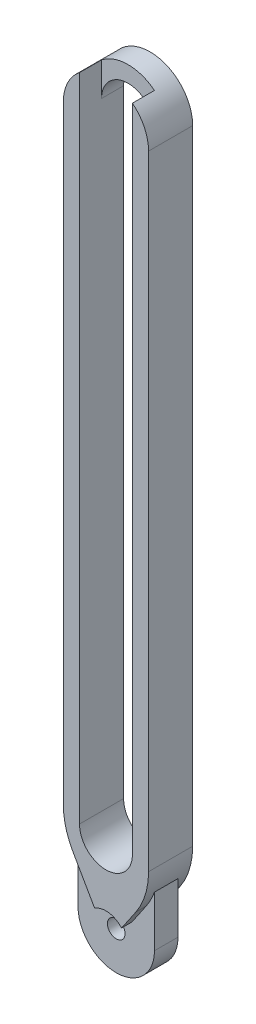
ISO-10303-21;
HEADER;
FILE_DESCRIPTION(('STEP AP214'),'2;1');
FILE_NAME('part.step','',(''),(''),'','','');
FILE_SCHEMA(('AUTOMOTIVE_DESIGN { 1 0 10303 214 1 1 1 1 }'));
ENDSEC;
DATA;
#1=APPLICATION_CONTEXT('core data for automotive mechanical design processes');
#2=APPLICATION_PROTOCOL_DEFINITION('international standard','automotive_design',2000,#1);
#3=PRODUCT_CONTEXT('',#1,'mechanical');
#4=PRODUCT('Part','Part','',(#3));
#5=PRODUCT_RELATED_PRODUCT_CATEGORY('part','',(#4));
#6=PRODUCT_DEFINITION_FORMATION('','',#4);
#7=PRODUCT_DEFINITION_CONTEXT('part definition',#1,'design');
#8=PRODUCT_DEFINITION('design','',#6,#7);
#9=PRODUCT_DEFINITION_SHAPE('','',#8);
#10=(LENGTH_UNIT() NAMED_UNIT(*) SI_UNIT(.MILLI.,.METRE.));
#11=(NAMED_UNIT(*) PLANE_ANGLE_UNIT() SI_UNIT($,.RADIAN.));
#12=(NAMED_UNIT(*) SI_UNIT($,.STERADIAN.) SOLID_ANGLE_UNIT());
#13=UNCERTAINTY_MEASURE_WITH_UNIT(LENGTH_MEASURE(1.E-05),#10,'distance_accuracy_value','');
#14=(GEOMETRIC_REPRESENTATION_CONTEXT(3) GLOBAL_UNCERTAINTY_ASSIGNED_CONTEXT((#13)) GLOBAL_UNIT_ASSIGNED_CONTEXT((#10,
#11,#12)) REPRESENTATION_CONTEXT('',''));
#15=CARTESIAN_POINT('',(0.,0.,0.));
#16=DIRECTION('',(0.,0.,1.));
#17=DIRECTION('',(1.,0.,0.));
#18=AXIS2_PLACEMENT_3D('',#15,#16,#17);
#19=CARTESIAN_POINT('',(0.,182.011383905916,-7.5));
#20=DIRECTION('',(0.,0.,1.));
#21=DIRECTION('',(1.,0.,0.));
#22=AXIS2_PLACEMENT_3D('',#19,#20,#21);
#23=CYLINDRICAL_SURFACE('',#22,9.);
#24=CARTESIAN_POINT('',(0.,182.011383905916,0.));
#25=DIRECTION('',(0.,0.,1.));
#26=DIRECTION('',(1.,0.,0.));
#27=AXIS2_PLACEMENT_3D('',#24,#25,#26);
#28=CIRCLE('',#27,9.);
#29=CARTESIAN_POINT('',(-9.,182.011383905916,0.));
#30=VERTEX_POINT('',#29);
#31=CARTESIAN_POINT('',(9.,182.011383905916,0.));
#32=VERTEX_POINT('',#31);
#33=EDGE_CURVE('E187',#30,#32,#28,.F.);
#34=ORIENTED_EDGE('',*,*,#33,.F.);
#35=DIRECTION('',(0.,0.,1.));
#36=VECTOR('',#35,1.);
#37=CARTESIAN_POINT('',(-9.,182.011383905916,-7.5));
#38=LINE('',#37,#36);
#39=CARTESIAN_POINT('',(-9.,182.011383905916,-7.5));
#40=VERTEX_POINT('',#39);
#41=EDGE_CURVE('E223',#40,#30,#38,.T.);
#42=ORIENTED_EDGE('',*,*,#41,.F.);
#43=CARTESIAN_POINT('',(0.,182.011383905916,-7.5));
#44=DIRECTION('',(0.,0.,1.));
#45=DIRECTION('',(1.,0.,0.));
#46=AXIS2_PLACEMENT_3D('',#43,#44,#45);
#47=CIRCLE('',#46,9.);
#48=CARTESIAN_POINT('',(9.,182.011383905916,-7.5));
#49=VERTEX_POINT('',#48);
#50=EDGE_CURVE('E208',#49,#40,#47,.T.);
#51=ORIENTED_EDGE('',*,*,#50,.F.);
#52=DIRECTION('',(0.,0.,1.));
#53=VECTOR('',#52,1.);
#54=CARTESIAN_POINT('',(9.,182.011383905916,-7.5));
#55=LINE('',#54,#53);
#56=EDGE_CURVE('E202',#49,#32,#55,.T.);
#57=ORIENTED_EDGE('',*,*,#56,.T.);
#58=EDGE_LOOP('',(#34,#42,#51,#57));
#59=FACE_BOUND('',#58,.T.);
#60=ADVANCED_FACE('F38',(#59),#23,.F.);
#61=CARTESIAN_POINT('',(5.29445936964023,-51.4874567844259,7.5));
#62=DIRECTION('',(0.826176472958624,-0.563411426516758,0.));
#63=DIRECTION('',(0.563411426516758,0.826176472958624,0.));
#64=AXIS2_PLACEMENT_3D('',#61,#62,#63);
#65=PLANE('',#64);
#66=DIRECTION('',(-0.563411426516758,-0.826176472958624,0.));
#67=VECTOR('',#66,1.);
#68=CARTESIAN_POINT('',(5.29445936964023,-51.4874567844259,-7.5));
#69=LINE('',#68,#67);
#70=CARTESIAN_POINT('',(10.1544118239656,-44.3609091347187,-7.5));
#71=VERTEX_POINT('',#70);
#72=CARTESIAN_POINT('',(5.29445936964023,-51.4874567844259,-7.5));
#73=VERTEX_POINT('',#72);
#74=EDGE_CURVE('E229',#71,#73,#69,.T.);
#75=ORIENTED_EDGE('',*,*,#74,.F.);
#76=DIRECTION('',(0.,0.,-1.));
#77=VECTOR('',#76,1.);
#78=CARTESIAN_POINT('',(10.1544118239656,-44.3609091347187,7.5));
#79=LINE('',#78,#77);
#80=CARTESIAN_POINT('',(10.1544118239656,-44.3609091347187,-4.));
#81=VERTEX_POINT('',#80);
#82=EDGE_CURVE('E324',#71,#81,#79,.F.);
#83=ORIENTED_EDGE('',*,*,#82,.T.);
#84=DIRECTION('',(-0.563411426516758,-0.826176472958624,0.));
#85=VECTOR('',#84,1.);
#86=CARTESIAN_POINT('',(5.29445936964023,-51.4874567844259,-4.));
#87=LINE('',#86,#85);
#88=CARTESIAN_POINT('',(5.29445936964023,-51.4874567844259,-4.));
#89=VERTEX_POINT('',#88);
#90=EDGE_CURVE('E214',#81,#89,#87,.T.);
#91=ORIENTED_EDGE('',*,*,#90,.T.);
#92=DIRECTION('',(0.,0.,1.));
#93=VECTOR('',#92,1.);
#94=CARTESIAN_POINT('',(5.29445936964023,-51.4874567844259,-7.5));
#95=LINE('',#94,#93);
#96=EDGE_CURVE('E240',#73,#89,#95,.T.);
#97=ORIENTED_EDGE('',*,*,#96,.F.);
#98=EDGE_LOOP('',(#75,#83,#91,#97));
#99=FACE_BOUND('',#98,.T.);
#100=ADVANCED_FACE('F384',(#99),#65,.T.);
#101=CARTESIAN_POINT('',(-3.84583251699359,-50.2177211342446,7.5));
#102=DIRECTION('',(-0.868365907058973,-0.495924037991352,0.));
#103=DIRECTION('',(0.495924037991352,-0.868365907058973,0.));
#104=AXIS2_PLACEMENT_3D('',#101,#102,#103);
#105=PLANE('',#104);
#106=DIRECTION('',(-0.495924037991352,0.868365907058973,0.));
#107=VECTOR('',#106,1.);
#108=CARTESIAN_POINT('',(-3.84583251699359,-50.2177211342446,7.5));
#109=LINE('',#108,#107);
#110=CARTESIAN_POINT('',(-3.84583251699359,-50.2177211342446,7.5));
#111=VERTEX_POINT('',#110);
#112=CARTESIAN_POINT('',(-11.2091476764743,-37.3245129862358,7.5));
#113=VERTEX_POINT('',#112);
#114=EDGE_CURVE('E246',#111,#113,#109,.T.);
#115=ORIENTED_EDGE('',*,*,#114,.T.);
#116=DIRECTION('',(0.,0.,-1.));
#117=VECTOR('',#116,1.);
#118=CARTESIAN_POINT('',(-11.2091476764743,-37.3245129862358,-7.5));
#119=LINE('',#118,#117);
#120=CARTESIAN_POINT('',(-11.2091476764743,-37.3245129862358,4.));
#121=VERTEX_POINT('',#120);
#122=EDGE_CURVE('E306',#113,#121,#119,.T.);
#123=ORIENTED_EDGE('',*,*,#122,.T.);
#124=DIRECTION('',(-0.495924037991352,0.868365907058973,0.));
#125=VECTOR('',#124,1.);
#126=CARTESIAN_POINT('',(-3.84583251699359,-50.2177211342446,4.));
#127=LINE('',#126,#125);
#128=CARTESIAN_POINT('',(-3.84583251699359,-50.2177211342446,4.));
#129=VERTEX_POINT('',#128);
#130=EDGE_CURVE('E255',#129,#121,#127,.T.);
#131=ORIENTED_EDGE('',*,*,#130,.F.);
#132=DIRECTION('',(0.,0.,-1.));
#133=VECTOR('',#132,1.);
#134=CARTESIAN_POINT('',(-3.84583251699359,-50.2177211342446,7.5));
#135=LINE('',#134,#133);
#136=EDGE_CURVE('E261',#111,#129,#135,.T.);
#137=ORIENTED_EDGE('',*,*,#136,.F.);
#138=EDGE_LOOP('',(#115,#123,#131,#137));
#139=FACE_BOUND('',#138,.T.);
#140=ADVANCED_FACE('F359',(#139),#105,.T.);
#141=CARTESIAN_POINT('',(-14.5,182.011383905916,7.5));
#142=DIRECTION('',(1.,0.,0.));
#143=DIRECTION('',(0.,1.,0.));
#144=AXIS2_PLACEMENT_3D('',#141,#142,#143);
#145=PLANE('',#144);
#146=DIRECTION('',(0.,-1.,0.));
#147=VECTOR('',#146,1.);
#148=CARTESIAN_POINT('',(-14.5,182.011383905916,-7.5));
#149=LINE('',#148,#147);
#150=CARTESIAN_POINT('',(-14.5,182.011383905916,-7.5));
#151=VERTEX_POINT('',#150);
#152=CARTESIAN_POINT('',(-14.5,-24.926412036452,-7.5));
#153=VERTEX_POINT('',#152);
#154=EDGE_CURVE('E294',#151,#153,#149,.T.);
#155=ORIENTED_EDGE('',*,*,#154,.T.);
#156=DIRECTION('',(0.,0.,-1.));
#157=VECTOR('',#156,1.);
#158=CARTESIAN_POINT('',(-14.5,-24.926412036452,7.5));
#159=LINE('',#158,#157);
#160=CARTESIAN_POINT('',(-14.5,-24.926412036452,7.5));
#161=VERTEX_POINT('',#160);
#162=EDGE_CURVE('E313',#153,#161,#159,.F.);
#163=ORIENTED_EDGE('',*,*,#162,.T.);
#164=DIRECTION('',(0.,-1.,0.));
#165=VECTOR('',#164,1.);
#166=CARTESIAN_POINT('',(-14.5,182.011383905916,7.5));
#167=LINE('',#166,#165);
#168=CARTESIAN_POINT('',(-14.5,182.011383905916,7.5));
#169=VERTEX_POINT('',#168);
#170=EDGE_CURVE('E285',#169,#161,#167,.T.);
#171=ORIENTED_EDGE('',*,*,#170,.F.);
#172=DIRECTION('',(0.,0.,-1.));
#173=VECTOR('',#172,1.);
#174=CARTESIAN_POINT('',(-14.5,182.011383905916,7.5));
#175=LINE('',#174,#173);
#176=EDGE_CURVE('E301',#169,#151,#175,.T.);
#177=ORIENTED_EDGE('',*,*,#176,.T.);
#178=EDGE_LOOP('',(#155,#163,#171,#177));
#179=FACE_BOUND('',#178,.T.);
#180=ADVANCED_FACE('F406',(#179),#145,.F.);
#181=CARTESIAN_POINT('',(0.,182.011383905916,7.5));
#182=DIRECTION('',(0.,0.,1.));
#183=DIRECTION('',(1.,0.,0.));
#184=AXIS2_PLACEMENT_3D('',#181,#182,#183);
#185=PLANE('',#184);
#186=DIRECTION('',(0.,-1.,0.));
#187=VECTOR('',#186,1.);
#188=CARTESIAN_POINT('',(-9.,182.011383905916,7.5));
#189=LINE('',#188,#187);
#190=CARTESIAN_POINT('',(-9.,193.380200906818,7.5));
#191=VERTEX_POINT('',#190);
#192=CARTESIAN_POINT('',(-8.99999999999998,-27.988616094084,7.5));
#193=VERTEX_POINT('',#192);
#194=EDGE_CURVE('E412',#191,#193,#189,.T.);
#195=ORIENTED_EDGE('',*,*,#194,.F.);
#196=CARTESIAN_POINT('',(0.,182.011383905916,7.5));
#197=DIRECTION('',(0.,0.,1.));
#198=DIRECTION('',(1.,0.,0.));
#199=AXIS2_PLACEMENT_3D('',#196,#197,#198);
#200=CIRCLE('',#199,14.5);
#201=EDGE_CURVE('E286',#191,#169,#200,.T.);
#202=ORIENTED_EDGE('',*,*,#201,.T.);
#203=ORIENTED_EDGE('',*,*,#170,.T.);
#204=CARTESIAN_POINT('',(10.5,-24.926412036452,7.5));
#205=DIRECTION('',(0.,0.,1.));
#206=DIRECTION('',(1.,0.,0.));
#207=AXIS2_PLACEMENT_3D('',#204,#205,#206);
#208=CIRCLE('',#207,25.);
#209=EDGE_CURVE('E317',#161,#113,#208,.T.);
#210=ORIENTED_EDGE('',*,*,#209,.T.);
#211=ORIENTED_EDGE('',*,*,#114,.F.);
#212=CARTESIAN_POINT('',(0.,-56.066616094084,7.5));
#213=DIRECTION('',(0.,0.,1.));
#214=DIRECTION('',(1.,0.,0.));
#215=AXIS2_PLACEMENT_3D('',#212,#213,#214);
#216=CIRCLE('',#215,7.);
#217=CARTESIAN_POINT('',(5.29445936964023,-51.4874567844259,7.5));
#218=VERTEX_POINT('',#217);
#219=EDGE_CURVE('E244',#218,#111,#216,.T.);
#220=ORIENTED_EDGE('',*,*,#219,.F.);
#221=DIRECTION('',(-0.563411426516758,-0.826176472958624,0.));
#222=VECTOR('',#221,1.);
#223=CARTESIAN_POINT('',(5.29445936964023,-51.4874567844259,7.5));
#224=LINE('',#223,#222);
#225=CARTESIAN_POINT('',(10.1544118239656,-44.3609091347187,7.5));
#226=VERTEX_POINT('',#225);
#227=EDGE_CURVE('E250',#226,#218,#224,.T.);
#228=ORIENTED_EDGE('',*,*,#227,.F.);
#229=CARTESIAN_POINT('',(-10.5,-30.2756234717997,7.5));
#230=DIRECTION('',(0.,0.,1.));
#231=DIRECTION('',(1.,0.,0.));
#232=AXIS2_PLACEMENT_3D('',#229,#230,#231);
#233=CIRCLE('',#232,25.);
#234=CARTESIAN_POINT('',(14.5,-30.2756234717997,7.5));
#235=VERTEX_POINT('',#234);
#236=EDGE_CURVE('E315',#226,#235,#233,.T.);
#237=ORIENTED_EDGE('',*,*,#236,.T.);
#238=DIRECTION('',(0.,1.,0.));
#239=VECTOR('',#238,1.);
#240=CARTESIAN_POINT('',(14.5,182.011383905916,7.5));
#241=LINE('',#240,#239);
#242=CARTESIAN_POINT('',(14.5,182.011383905916,7.5));
#243=VERTEX_POINT('',#242);
#244=EDGE_CURVE('E289',#235,#243,#241,.T.);
#245=ORIENTED_EDGE('',*,*,#244,.T.);
#246=CARTESIAN_POINT('',(9.,193.380200906818,7.5));
#247=VERTEX_POINT('',#246);
#248=EDGE_CURVE('E282',#243,#247,#200,.T.);
#249=ORIENTED_EDGE('',*,*,#248,.T.);
#250=DIRECTION('',(0.,1.,0.));
#251=VECTOR('',#250,1.);
#252=CARTESIAN_POINT('',(9.,182.011383905916,7.5));
#253=LINE('',#252,#251);
#254=CARTESIAN_POINT('',(9.00000000000003,-27.988616094084,7.5));
#255=VERTEX_POINT('',#254);
#256=EDGE_CURVE('E219',#255,#247,#253,.T.);
#257=ORIENTED_EDGE('',*,*,#256,.F.);
#258=CARTESIAN_POINT('',(0.,-27.988616094084,7.5));
#259=DIRECTION('',(0.,0.,1.));
#260=DIRECTION('',(1.,0.,0.));
#261=AXIS2_PLACEMENT_3D('',#258,#259,#260);
#262=CIRCLE('',#261,9.);
#263=EDGE_CURVE('E414',#193,#255,#262,.T.);
#264=ORIENTED_EDGE('',*,*,#263,.F.);
#265=EDGE_LOOP('',(#195,#202,#203,#210,#211,#220,#228,#237,#245,#249,#257,#264));
#266=FACE_BOUND('',#265,.T.);
#267=ADVANCED_FACE('F402',(#266),#185,.T.);
#268=CARTESIAN_POINT('',(0.,182.011383905916,7.5));
#269=DIRECTION('',(0.,0.,-1.));
#270=DIRECTION('',(-1.,0.,0.));
#271=AXIS2_PLACEMENT_3D('',#268,#269,#270);
#272=CYLINDRICAL_SURFACE('',#271,14.5);
#273=ORIENTED_EDGE('',*,*,#201,.F.);
#274=DIRECTION('',(0.,0.,-1.));
#275=VECTOR('',#274,1.);
#276=CARTESIAN_POINT('',(-9.,193.380200906818,7.5));
#277=LINE('',#276,#275);
#278=CARTESIAN_POINT('',(-9.,193.380200906818,0.));
#279=VERTEX_POINT('',#278);
#280=EDGE_CURVE('E409',#191,#279,#277,.T.);
#281=ORIENTED_EDGE('',*,*,#280,.T.);
#282=CARTESIAN_POINT('',(0.,182.011383905916,0.));
#283=DIRECTION('',(0.,0.,1.));
#284=DIRECTION('',(1.,0.,0.));
#285=AXIS2_PLACEMENT_3D('',#282,#283,#284);
#286=CIRCLE('',#285,14.5);
#287=CARTESIAN_POINT('',(9.,193.380200906818,0.));
#288=VERTEX_POINT('',#287);
#289=EDGE_CURVE('E197',#288,#279,#286,.T.);
#290=ORIENTED_EDGE('',*,*,#289,.F.);
#291=DIRECTION('',(0.,0.,-1.));
#292=VECTOR('',#291,1.);
#293=CARTESIAN_POINT('',(9.,193.380200906818,7.5));
#294=LINE('',#293,#292);
#295=EDGE_CURVE('E205',#288,#247,#294,.F.);
#296=ORIENTED_EDGE('',*,*,#295,.T.);
#297=ORIENTED_EDGE('',*,*,#248,.F.);
#298=DIRECTION('',(0.,0.,-1.));
#299=VECTOR('',#298,1.);
#300=CARTESIAN_POINT('',(14.5,182.011383905916,7.5));
#301=LINE('',#300,#299);
#302=CARTESIAN_POINT('',(14.5,182.011383905916,-7.5));
#303=VERTEX_POINT('',#302);
#304=EDGE_CURVE('E291',#243,#303,#301,.T.);
#305=ORIENTED_EDGE('',*,*,#304,.T.);
#306=CARTESIAN_POINT('',(0.,182.011383905916,-7.5));
#307=DIRECTION('',(0.,0.,1.));
#308=DIRECTION('',(1.,0.,0.));
#309=AXIS2_PLACEMENT_3D('',#306,#307,#308);
#310=CIRCLE('',#309,14.5);
#311=EDGE_CURVE('E281',#303,#151,#310,.T.);
#312=ORIENTED_EDGE('',*,*,#311,.T.);
#313=ORIENTED_EDGE('',*,*,#176,.F.);
#314=EDGE_LOOP('',(#273,#281,#290,#296,#297,#305,#312,#313));
#315=FACE_BOUND('',#314,.T.);
#316=ADVANCED_FACE('F398',(#315),#272,.T.);
#317=CARTESIAN_POINT('',(14.5,182.011383905916,7.5));
#318=DIRECTION('',(-1.,0.,0.));
#319=DIRECTION('',(0.,-1.,0.));
#320=AXIS2_PLACEMENT_3D('',#317,#318,#319);
#321=PLANE('',#320);
#322=ORIENTED_EDGE('',*,*,#244,.F.);
#323=DIRECTION('',(0.,0.,-1.));
#324=VECTOR('',#323,1.);
#325=CARTESIAN_POINT('',(14.5,-30.2756234717997,-7.5));
#326=LINE('',#325,#324);
#327=CARTESIAN_POINT('',(14.5,-30.2756234717997,-7.5));
#328=VERTEX_POINT('',#327);
#329=EDGE_CURVE('E319',#235,#328,#326,.T.);
#330=ORIENTED_EDGE('',*,*,#329,.T.);
#331=DIRECTION('',(0.,1.,0.));
#332=VECTOR('',#331,1.);
#333=CARTESIAN_POINT('',(14.5,182.011383905916,-7.5));
#334=LINE('',#333,#332);
#335=EDGE_CURVE('E297',#328,#303,#334,.T.);
#336=ORIENTED_EDGE('',*,*,#335,.T.);
#337=ORIENTED_EDGE('',*,*,#304,.F.);
#338=EDGE_LOOP('',(#322,#330,#336,#337));
#339=FACE_BOUND('',#338,.T.);
#340=ADVANCED_FACE('F394',(#339),#321,.F.);
#341=CARTESIAN_POINT('',(0.,182.011383905916,-7.5));
#342=DIRECTION('',(0.,0.,1.));
#343=DIRECTION('',(1.,0.,0.));
#344=AXIS2_PLACEMENT_3D('',#341,#342,#343);
#345=PLANE('',#344);
#346=DIRECTION('',(0.,1.,0.));
#347=VECTOR('',#346,1.);
#348=CARTESIAN_POINT('',(9.,182.011383905916,-7.5));
#349=LINE('',#348,#347);
#350=CARTESIAN_POINT('',(9.00000000000003,-27.988616094084,-7.5));
#351=VERTEX_POINT('',#350);
#352=EDGE_CURVE('E225',#351,#49,#349,.T.);
#353=ORIENTED_EDGE('',*,*,#352,.T.);
#354=ORIENTED_EDGE('',*,*,#50,.T.);
#355=DIRECTION('',(0.,-1.,0.));
#356=VECTOR('',#355,1.);
#357=CARTESIAN_POINT('',(-9.,182.011383905916,-7.5));
#358=LINE('',#357,#356);
#359=CARTESIAN_POINT('',(-8.99999999999998,-27.988616094084,-7.5));
#360=VERTEX_POINT('',#359);
#361=EDGE_CURVE('E420',#40,#360,#358,.T.);
#362=ORIENTED_EDGE('',*,*,#361,.T.);
#363=CARTESIAN_POINT('',(0.,-27.988616094084,-7.5));
#364=DIRECTION('',(0.,0.,1.));
#365=DIRECTION('',(1.,0.,0.));
#366=AXIS2_PLACEMENT_3D('',#363,#364,#365);
#367=CIRCLE('',#366,9.);
#368=EDGE_CURVE('E54',#360,#351,#367,.T.);
#369=ORIENTED_EDGE('',*,*,#368,.T.);
#370=EDGE_LOOP('',(#353,#354,#362,#369));
#371=FACE_BOUND('',#370,.T.);
#372=DIRECTION('',(-0.495924037991352,0.868365907058973,0.));
#373=VECTOR('',#372,1.);
#374=CARTESIAN_POINT('',(-3.84583251699359,-50.2177211342446,-7.5));
#375=LINE('',#374,#373);
#376=CARTESIAN_POINT('',(-3.84583251699359,-50.2177211342446,-7.5));
#377=VERTEX_POINT('',#376);
#378=CARTESIAN_POINT('',(-11.2091476764743,-37.3245129862358,-7.5));
#379=VERTEX_POINT('',#378);
#380=EDGE_CURVE('E232',#377,#379,#375,.T.);
#381=ORIENTED_EDGE('',*,*,#380,.T.);
#382=CARTESIAN_POINT('',(10.5,-24.926412036452,-7.5));
#383=DIRECTION('',(0.,0.,1.));
#384=DIRECTION('',(1.,0.,0.));
#385=AXIS2_PLACEMENT_3D('',#382,#383,#384);
#386=CIRCLE('',#385,25.);
#387=EDGE_CURVE('E311',#379,#153,#386,.F.);
#388=ORIENTED_EDGE('',*,*,#387,.T.);
#389=ORIENTED_EDGE('',*,*,#154,.F.);
#390=ORIENTED_EDGE('',*,*,#311,.F.);
#391=ORIENTED_EDGE('',*,*,#335,.F.);
#392=CARTESIAN_POINT('',(-10.5,-30.2756234717997,-7.5));
#393=DIRECTION('',(0.,0.,1.));
#394=DIRECTION('',(1.,0.,0.));
#395=AXIS2_PLACEMENT_3D('',#392,#393,#394);
#396=CIRCLE('',#395,25.);
#397=EDGE_CURVE('E309',#328,#71,#396,.F.);
#398=ORIENTED_EDGE('',*,*,#397,.T.);
#399=ORIENTED_EDGE('',*,*,#74,.T.);
#400=CARTESIAN_POINT('',(0.,-56.066616094084,-7.5));
#401=DIRECTION('',(0.,0.,1.));
#402=DIRECTION('',(1.,0.,0.));
#403=AXIS2_PLACEMENT_3D('',#400,#401,#402);
#404=CIRCLE('',#403,7.);
#405=EDGE_CURVE('E226',#73,#377,#404,.T.);
#406=ORIENTED_EDGE('',*,*,#405,.T.);
#407=EDGE_LOOP('',(#381,#388,#389,#390,#391,#398,#399,#406));
#408=FACE_BOUND('',#407,.T.);
#409=ADVANCED_FACE('F388',(#371,#408),#345,.F.);
#410=CARTESIAN_POINT('',(-13.,-40.066616094084,4.));
#411=DIRECTION('',(1.,0.,0.));
#412=DIRECTION('',(0.,1.,0.));
#413=AXIS2_PLACEMENT_3D('',#410,#411,#412);
#414=PLANE('',#413);
#415=DIRECTION('',(0.,-1.,0.));
#416=VECTOR('',#415,1.);
#417=CARTESIAN_POINT('',(-13.,-40.066616094084,4.));
#418=LINE('',#417,#416);
#419=CARTESIAN_POINT('',(-13.,-33.4557730910679,4.));
#420=VERTEX_POINT('',#419);
#421=CARTESIAN_POINT('',(-13.,-56.066616094084,4.));
#422=VERTEX_POINT('',#421);
#423=EDGE_CURVE('E265',#420,#422,#418,.T.);
#424=ORIENTED_EDGE('',*,*,#423,.F.);
#425=DIRECTION('',(0.,0.,1.));
#426=VECTOR('',#425,1.);
#427=CARTESIAN_POINT('',(-13.,-33.4557730910679,4.));
#428=LINE('',#427,#426);
#429=CARTESIAN_POINT('',(-13.,-33.4557730910679,-4.));
#430=VERTEX_POINT('',#429);
#431=EDGE_CURVE('E329',#420,#430,#428,.F.);
#432=ORIENTED_EDGE('',*,*,#431,.T.);
#433=DIRECTION('',(0.,-1.,0.));
#434=VECTOR('',#433,1.);
#435=CARTESIAN_POINT('',(-13.,-40.066616094084,-4.));
#436=LINE('',#435,#434);
#437=CARTESIAN_POINT('',(-13.,-56.066616094084,-4.));
#438=VERTEX_POINT('',#437);
#439=EDGE_CURVE('E264',#430,#438,#436,.T.);
#440=ORIENTED_EDGE('',*,*,#439,.T.);
#441=DIRECTION('',(0.,0.,-1.));
#442=VECTOR('',#441,1.);
#443=CARTESIAN_POINT('',(-13.,-56.066616094084,4.));
#444=LINE('',#443,#442);
#445=EDGE_CURVE('E278',#422,#438,#444,.T.);
#446=ORIENTED_EDGE('',*,*,#445,.F.);
#447=EDGE_LOOP('',(#424,#432,#440,#446));
#448=FACE_BOUND('',#447,.T.);
#449=ADVANCED_FACE('F369',(#448),#414,.F.);
#450=CARTESIAN_POINT('',(13.,-40.066616094084,4.));
#451=DIRECTION('',(-1.,0.,0.));
#452=DIRECTION('',(0.,-1.,0.));
#453=AXIS2_PLACEMENT_3D('',#450,#451,#452);
#454=PLANE('',#453);
#455=DIRECTION('',(0.,1.,0.));
#456=VECTOR('',#455,1.);
#457=CARTESIAN_POINT('',(13.,-40.066616094084,-4.));
#458=LINE('',#457,#456);
#459=CARTESIAN_POINT('',(13.,-56.066616094084,-4.));
#460=VERTEX_POINT('',#459);
#461=CARTESIAN_POINT('',(13.,-38.8049845264158,-4.));
#462=VERTEX_POINT('',#461);
#463=EDGE_CURVE('E268',#460,#462,#458,.T.);
#464=ORIENTED_EDGE('',*,*,#463,.T.);
#465=DIRECTION('',(0.,0.,1.));
#466=VECTOR('',#465,1.);
#467=CARTESIAN_POINT('',(13.,-38.8049845264158,-4.));
#468=LINE('',#467,#466);
#469=CARTESIAN_POINT('',(13.,-38.8049845264158,4.));
#470=VERTEX_POINT('',#469);
#471=EDGE_CURVE('E47',#462,#470,#468,.T.);
#472=ORIENTED_EDGE('',*,*,#471,.T.);
#473=DIRECTION('',(0.,1.,0.));
#474=VECTOR('',#473,1.);
#475=CARTESIAN_POINT('',(13.,-40.066616094084,4.));
#476=LINE('',#475,#474);
#477=CARTESIAN_POINT('',(13.,-56.066616094084,4.));
#478=VERTEX_POINT('',#477);
#479=EDGE_CURVE('E61',#478,#470,#476,.T.);
#480=ORIENTED_EDGE('',*,*,#479,.F.);
#481=DIRECTION('',(0.,0.,-1.));
#482=VECTOR('',#481,1.);
#483=CARTESIAN_POINT('',(13.,-56.066616094084,4.));
#484=LINE('',#483,#482);
#485=EDGE_CURVE('E271',#478,#460,#484,.T.);
#486=ORIENTED_EDGE('',*,*,#485,.T.);
#487=EDGE_LOOP('',(#464,#472,#480,#486));
#488=FACE_BOUND('',#487,.T.);
#489=ADVANCED_FACE('F340',(#488),#454,.F.);
#490=CARTESIAN_POINT('',(0.,-56.066616094084,4.));
#491=DIRECTION('',(0.,0.,-1.));
#492=DIRECTION('',(-1.,0.,0.));
#493=AXIS2_PLACEMENT_3D('',#490,#491,#492);
#494=CYLINDRICAL_SURFACE('',#493,13.);
#495=CARTESIAN_POINT('',(0.,-56.066616094084,-4.));
#496=DIRECTION('',(0.,0.,1.));
#497=DIRECTION('',(1.,0.,0.));
#498=AXIS2_PLACEMENT_3D('',#495,#496,#497);
#499=CIRCLE('',#498,13.);
#500=EDGE_CURVE('E273',#438,#460,#499,.T.);
#501=ORIENTED_EDGE('',*,*,#500,.T.);
#502=ORIENTED_EDGE('',*,*,#485,.F.);
#503=CARTESIAN_POINT('',(0.,-56.066616094084,4.));
#504=DIRECTION('',(0.,0.,1.));
#505=DIRECTION('',(1.,0.,0.));
#506=AXIS2_PLACEMENT_3D('',#503,#504,#505);
#507=CIRCLE('',#506,13.);
#508=EDGE_CURVE('E267',#422,#478,#507,.T.);
#509=ORIENTED_EDGE('',*,*,#508,.F.);
#510=ORIENTED_EDGE('',*,*,#445,.T.);
#511=EDGE_LOOP('',(#501,#502,#509,#510));
#512=FACE_BOUND('',#511,.T.);
#513=ADVANCED_FACE('F374',(#512),#494,.T.);
#514=CARTESIAN_POINT('',(0.,-40.066616094084,4.));
#515=DIRECTION('',(0.,0.,1.));
#516=DIRECTION('',(1.,0.,0.));
#517=AXIS2_PLACEMENT_3D('',#514,#515,#516);
#518=PLANE('',#517);
#519=CARTESIAN_POINT('',(0.,-56.066616094084,4.));
#520=DIRECTION('',(0.,0.,1.));
#521=DIRECTION('',(1.,0.,0.));
#522=AXIS2_PLACEMENT_3D('',#519,#520,#521);
#523=CIRCLE('',#522,3.);
#524=CARTESIAN_POINT('',(3.,-56.066616094084,4.));
#525=VERTEX_POINT('',#524);
#526=EDGE_CURVE('E542',#525,#525,#523,.T.);
#527=ORIENTED_EDGE('',*,*,#526,.F.);
#528=EDGE_LOOP('',(#527));
#529=FACE_BOUND('',#528,.T.);
#530=ORIENTED_EDGE('',*,*,#130,.T.);
#531=CARTESIAN_POINT('',(10.5,-24.926412036452,4.));
#532=DIRECTION('',(0.,0.,1.));
#533=DIRECTION('',(1.,0.,0.));
#534=AXIS2_PLACEMENT_3D('',#531,#532,#533);
#535=CIRCLE('',#534,25.);
#536=EDGE_CURVE('E326',#121,#420,#535,.F.);
#537=ORIENTED_EDGE('',*,*,#536,.T.);
#538=ORIENTED_EDGE('',*,*,#423,.T.);
#539=ORIENTED_EDGE('',*,*,#508,.T.);
#540=ORIENTED_EDGE('',*,*,#479,.T.);
#541=CARTESIAN_POINT('',(-10.5,-30.2756234717997,4.));
#542=DIRECTION('',(0.,0.,1.));
#543=DIRECTION('',(1.,0.,0.));
#544=AXIS2_PLACEMENT_3D('',#541,#542,#543);
#545=CIRCLE('',#544,25.);
#546=CARTESIAN_POINT('',(10.1544118239656,-44.3609091347187,4.));
#547=VERTEX_POINT('',#546);
#548=EDGE_CURVE('E11',#470,#547,#545,.F.);
#549=ORIENTED_EDGE('',*,*,#548,.T.);
#550=DIRECTION('',(-0.563411426516758,-0.826176472958624,0.));
#551=VECTOR('',#550,1.);
#552=CARTESIAN_POINT('',(5.29445936964023,-51.4874567844259,4.));
#553=LINE('',#552,#551);
#554=CARTESIAN_POINT('',(5.29445936964023,-51.4874567844259,4.));
#555=VERTEX_POINT('',#554);
#556=EDGE_CURVE('E247',#547,#555,#553,.T.);
#557=ORIENTED_EDGE('',*,*,#556,.T.);
#558=CARTESIAN_POINT('',(0.,-56.066616094084,4.));
#559=DIRECTION('',(0.,0.,1.));
#560=DIRECTION('',(1.,0.,0.));
#561=AXIS2_PLACEMENT_3D('',#558,#559,#560);
#562=CIRCLE('',#561,7.);
#563=EDGE_CURVE('E243',#555,#129,#562,.T.);
#564=ORIENTED_EDGE('',*,*,#563,.T.);
#565=EDGE_LOOP('',(#530,#537,#538,#539,#540,#549,#557,#564));
#566=FACE_BOUND('',#565,.T.);
#567=ADVANCED_FACE('F347',(#529,#566),#518,.T.);
#568=CARTESIAN_POINT('',(0.,-40.066616094084,-4.));
#569=DIRECTION('',(0.,0.,1.));
#570=DIRECTION('',(1.,0.,0.));
#571=AXIS2_PLACEMENT_3D('',#568,#569,#570);
#572=PLANE('',#571);
#573=CARTESIAN_POINT('',(0.,-56.066616094084,-4.));
#574=DIRECTION('',(0.,0.,1.));
#575=DIRECTION('',(1.,0.,0.));
#576=AXIS2_PLACEMENT_3D('',#573,#574,#575);
#577=CIRCLE('',#576,3.);
#578=CARTESIAN_POINT('',(3.,-56.066616094084,-4.));
#579=VERTEX_POINT('',#578);
#580=EDGE_CURVE('E42',#579,#579,#577,.T.);
#581=ORIENTED_EDGE('',*,*,#580,.T.);
#582=EDGE_LOOP('',(#581));
#583=FACE_BOUND('',#582,.T.);
#584=ORIENTED_EDGE('',*,*,#439,.F.);
#585=CARTESIAN_POINT('',(10.5,-24.926412036452,-4.));
#586=DIRECTION('',(0.,0.,1.));
#587=DIRECTION('',(1.,0.,0.));
#588=AXIS2_PLACEMENT_3D('',#585,#586,#587);
#589=CIRCLE('',#588,25.);
#590=CARTESIAN_POINT('',(-11.2091476764743,-37.3245129862358,-4.));
#591=VERTEX_POINT('',#590);
#592=EDGE_CURVE('E332',#430,#591,#589,.T.);
#593=ORIENTED_EDGE('',*,*,#592,.T.);
#594=DIRECTION('',(-0.495924037991352,0.868365907058973,0.));
#595=VECTOR('',#594,1.);
#596=CARTESIAN_POINT('',(-3.84583251699359,-50.2177211342446,-4.));
#597=LINE('',#596,#595);
#598=CARTESIAN_POINT('',(-3.84583251699359,-50.2177211342446,-4.));
#599=VERTEX_POINT('',#598);
#600=EDGE_CURVE('E230',#599,#591,#597,.T.);
#601=ORIENTED_EDGE('',*,*,#600,.F.);
#602=CARTESIAN_POINT('',(0.,-56.066616094084,-4.));
#603=DIRECTION('',(0.,0.,1.));
#604=DIRECTION('',(1.,0.,0.));
#605=AXIS2_PLACEMENT_3D('',#602,#603,#604);
#606=CIRCLE('',#605,7.);
#607=EDGE_CURVE('E210',#89,#599,#606,.T.);
#608=ORIENTED_EDGE('',*,*,#607,.F.);
#609=ORIENTED_EDGE('',*,*,#90,.F.);
#610=CARTESIAN_POINT('',(-10.5,-30.2756234717997,-4.));
#611=DIRECTION('',(0.,0.,1.));
#612=DIRECTION('',(1.,0.,0.));
#613=AXIS2_PLACEMENT_3D('',#610,#611,#612);
#614=CIRCLE('',#613,25.);
#615=EDGE_CURVE('E334',#81,#462,#614,.T.);
#616=ORIENTED_EDGE('',*,*,#615,.T.);
#617=ORIENTED_EDGE('',*,*,#463,.F.);
#618=ORIENTED_EDGE('',*,*,#500,.F.);
#619=EDGE_LOOP('',(#584,#593,#601,#608,#609,#616,#617,#618));
#620=FACE_BOUND('',#619,.T.);
#621=ADVANCED_FACE('F377',(#583,#620),#572,.F.);
#622=CARTESIAN_POINT('',(0.,-56.066616094084,7.5));
#623=DIRECTION('',(0.,0.,-1.));
#624=DIRECTION('',(-1.,0.,0.));
#625=AXIS2_PLACEMENT_3D('',#622,#623,#624);
#626=CYLINDRICAL_SURFACE('',#625,7.);
#627=ORIENTED_EDGE('',*,*,#563,.F.);
#628=DIRECTION('',(0.,0.,-1.));
#629=VECTOR('',#628,1.);
#630=CARTESIAN_POINT('',(5.29445936964023,-51.4874567844259,7.5));
#631=LINE('',#630,#629);
#632=EDGE_CURVE('E252',#218,#555,#631,.T.);
#633=ORIENTED_EDGE('',*,*,#632,.F.);
#634=ORIENTED_EDGE('',*,*,#219,.T.);
#635=ORIENTED_EDGE('',*,*,#136,.T.);
#636=EDGE_LOOP('',(#627,#633,#634,#635));
#637=FACE_BOUND('',#636,.T.);
#638=ADVANCED_FACE('F355',(#637),#626,.F.);
#639=ORIENTED_EDGE('',*,*,#600,.T.);
#640=DIRECTION('',(0.,0.,-1.));
#641=VECTOR('',#640,1.);
#642=CARTESIAN_POINT('',(-11.2091476764743,-37.3245129862358,-7.5));
#643=LINE('',#642,#641);
#644=EDGE_CURVE('E304',#591,#379,#643,.T.);
#645=ORIENTED_EDGE('',*,*,#644,.T.);
#646=ORIENTED_EDGE('',*,*,#380,.F.);
#647=DIRECTION('',(0.,0.,1.));
#648=VECTOR('',#647,1.);
#649=CARTESIAN_POINT('',(-3.84583251699359,-50.2177211342446,-7.5));
#650=LINE('',#649,#648);
#651=EDGE_CURVE('E234',#377,#599,#650,.T.);
#652=ORIENTED_EDGE('',*,*,#651,.T.);
#653=EDGE_LOOP('',(#639,#645,#646,#652));
#654=FACE_BOUND('',#653,.T.);
#655=ADVANCED_FACE('F447',(#654),#105,.T.);
#656=ORIENTED_EDGE('',*,*,#556,.F.);
#657=DIRECTION('',(0.,0.,-1.));
#658=VECTOR('',#657,1.);
#659=CARTESIAN_POINT('',(10.1544118239656,-44.3609091347187,7.5));
#660=LINE('',#659,#658);
#661=EDGE_CURVE('E322',#547,#226,#660,.F.);
#662=ORIENTED_EDGE('',*,*,#661,.T.);
#663=ORIENTED_EDGE('',*,*,#227,.T.);
#664=ORIENTED_EDGE('',*,*,#632,.T.);
#665=EDGE_LOOP('',(#656,#662,#663,#664));
#666=FACE_BOUND('',#665,.T.);
#667=ADVANCED_FACE('F349',(#666),#65,.T.);
#668=CARTESIAN_POINT('',(0.,-56.066616094084,-7.5));
#669=DIRECTION('',(0.,0.,1.));
#670=DIRECTION('',(1.,0.,0.));
#671=AXIS2_PLACEMENT_3D('',#668,#669,#670);
#672=CYLINDRICAL_SURFACE('',#671,7.);
#673=ORIENTED_EDGE('',*,*,#607,.T.);
#674=ORIENTED_EDGE('',*,*,#651,.F.);
#675=ORIENTED_EDGE('',*,*,#405,.F.);
#676=ORIENTED_EDGE('',*,*,#96,.T.);
#677=EDGE_LOOP('',(#673,#674,#675,#676));
#678=FACE_BOUND('',#677,.T.);
#679=ADVANCED_FACE('F442',(#678),#672,.F.);
#680=CARTESIAN_POINT('',(10.5,-24.926412036452,7.5));
#681=DIRECTION('',(0.,0.,1.));
#682=DIRECTION('',(1.,0.,0.));
#683=AXIS2_PLACEMENT_3D('',#680,#681,#682);
#684=CYLINDRICAL_SURFACE('',#683,25.);
#685=ORIENTED_EDGE('',*,*,#209,.F.);
#686=ORIENTED_EDGE('',*,*,#162,.F.);
#687=ORIENTED_EDGE('',*,*,#387,.F.);
#688=ORIENTED_EDGE('',*,*,#644,.F.);
#689=ORIENTED_EDGE('',*,*,#592,.F.);
#690=ORIENTED_EDGE('',*,*,#431,.F.);
#691=ORIENTED_EDGE('',*,*,#536,.F.);
#692=ORIENTED_EDGE('',*,*,#122,.F.);
#693=EDGE_LOOP('',(#685,#686,#687,#688,#689,#690,#691,#692));
#694=FACE_BOUND('',#693,.T.);
#695=ADVANCED_FACE('F364',(#694),#684,.T.);
#696=CARTESIAN_POINT('',(-10.5,-30.2756234717997,7.5));
#697=DIRECTION('',(0.,0.,1.));
#698=DIRECTION('',(1.,0.,0.));
#699=AXIS2_PLACEMENT_3D('',#696,#697,#698);
#700=CYLINDRICAL_SURFACE('',#699,25.);
#701=ORIENTED_EDGE('',*,*,#615,.F.);
#702=ORIENTED_EDGE('',*,*,#82,.F.);
#703=ORIENTED_EDGE('',*,*,#397,.F.);
#704=ORIENTED_EDGE('',*,*,#329,.F.);
#705=ORIENTED_EDGE('',*,*,#236,.F.);
#706=ORIENTED_EDGE('',*,*,#661,.F.);
#707=ORIENTED_EDGE('',*,*,#548,.F.);
#708=ORIENTED_EDGE('',*,*,#471,.F.);
#709=EDGE_LOOP('',(#701,#702,#703,#704,#705,#706,#707,#708));
#710=FACE_BOUND('',#709,.T.);
#711=ADVANCED_FACE('F40',(#710),#700,.T.);
#712=CARTESIAN_POINT('',(9.,182.011383905916,-7.5));
#713=DIRECTION('',(1.,0.,0.));
#714=DIRECTION('',(0.,1.,0.));
#715=AXIS2_PLACEMENT_3D('',#712,#713,#714);
#716=PLANE('',#715);
#717=ORIENTED_EDGE('',*,*,#256,.T.);
#718=ORIENTED_EDGE('',*,*,#295,.F.);
#719=DIRECTION('',(0.,1.,0.));
#720=VECTOR('',#719,1.);
#721=CARTESIAN_POINT('',(9.,182.011383905916,0.));
#722=LINE('',#721,#720);
#723=EDGE_CURVE('E190',#32,#288,#722,.T.);
#724=ORIENTED_EDGE('',*,*,#723,.F.);
#725=ORIENTED_EDGE('',*,*,#56,.F.);
#726=ORIENTED_EDGE('',*,*,#352,.F.);
#727=DIRECTION('',(0.,0.,1.));
#728=VECTOR('',#727,1.);
#729=CARTESIAN_POINT('',(9.00000000000003,-27.988616094084,-7.5));
#730=LINE('',#729,#728);
#731=EDGE_CURVE('E211',#351,#255,#730,.T.);
#732=ORIENTED_EDGE('',*,*,#731,.T.);
#733=EDGE_LOOP('',(#717,#718,#724,#725,#726,#732));
#734=FACE_BOUND('',#733,.T.);
#735=ADVANCED_FACE('F200',(#734),#716,.F.);
#736=CARTESIAN_POINT('',(0.,-27.988616094084,-7.5));
#737=DIRECTION('',(0.,0.,1.));
#738=DIRECTION('',(1.,0.,0.));
#739=AXIS2_PLACEMENT_3D('',#736,#737,#738);
#740=CYLINDRICAL_SURFACE('',#739,9.);
#741=ORIENTED_EDGE('',*,*,#263,.T.);
#742=ORIENTED_EDGE('',*,*,#731,.F.);
#743=ORIENTED_EDGE('',*,*,#368,.F.);
#744=DIRECTION('',(0.,0.,1.));
#745=VECTOR('',#744,1.);
#746=CARTESIAN_POINT('',(-8.99999999999998,-27.988616094084,-7.5));
#747=LINE('',#746,#745);
#748=EDGE_CURVE('E216',#360,#193,#747,.T.);
#749=ORIENTED_EDGE('',*,*,#748,.T.);
#750=EDGE_LOOP('',(#741,#742,#743,#749));
#751=FACE_BOUND('',#750,.T.);
#752=ADVANCED_FACE('F425',(#751),#740,.F.);
#753=CARTESIAN_POINT('',(-9.,182.011383905916,-7.5));
#754=DIRECTION('',(-1.,0.,0.));
#755=DIRECTION('',(0.,-1.,0.));
#756=AXIS2_PLACEMENT_3D('',#753,#754,#755);
#757=PLANE('',#756);
#758=ORIENTED_EDGE('',*,*,#194,.T.);
#759=ORIENTED_EDGE('',*,*,#748,.F.);
#760=ORIENTED_EDGE('',*,*,#361,.F.);
#761=ORIENTED_EDGE('',*,*,#41,.T.);
#762=DIRECTION('',(0.,-1.,0.));
#763=VECTOR('',#762,1.);
#764=CARTESIAN_POINT('',(-9.,182.011383905916,0.));
#765=LINE('',#764,#763);
#766=EDGE_CURVE('E193',#279,#30,#765,.T.);
#767=ORIENTED_EDGE('',*,*,#766,.F.);
#768=ORIENTED_EDGE('',*,*,#280,.F.);
#769=EDGE_LOOP('',(#758,#759,#760,#761,#767,#768));
#770=FACE_BOUND('',#769,.T.);
#771=ADVANCED_FACE('F427',(#770),#757,.F.);
#772=CARTESIAN_POINT('',(0.,182.011383905916,0.));
#773=DIRECTION('',(0.,0.,1.));
#774=DIRECTION('',(1.,0.,0.));
#775=AXIS2_PLACEMENT_3D('',#772,#773,#774);
#776=PLANE('',#775);
#777=ORIENTED_EDGE('',*,*,#289,.T.);
#778=ORIENTED_EDGE('',*,*,#766,.T.);
#779=ORIENTED_EDGE('',*,*,#33,.T.);
#780=ORIENTED_EDGE('',*,*,#723,.T.);
#781=EDGE_LOOP('',(#777,#778,#779,#780));
#782=FACE_BOUND('',#781,.T.);
#783=ADVANCED_FACE('F189',(#782),#776,.T.);
#784=CARTESIAN_POINT('',(0.,-56.066616094084,-7.5));
#785=DIRECTION('',(0.,0.,1.));
#786=DIRECTION('',(1.,0.,0.));
#787=AXIS2_PLACEMENT_3D('',#784,#785,#786);
#788=CYLINDRICAL_SURFACE('',#787,3.);
#789=ORIENTED_EDGE('',*,*,#526,.T.);
#790=EDGE_LOOP('',(#789));
#791=FACE_BOUND('',#790,.T.);
#792=ORIENTED_EDGE('',*,*,#580,.F.);
#793=EDGE_LOOP('',(#792));
#794=FACE_BOUND('',#793,.T.);
#795=ADVANCED_FACE('F508',(#791,#794),#788,.F.);
#796=CLOSED_SHELL('',(#60,#100,#140,#180,#267,#316,#340,#409,#449,#489,#513,#567,#621,#638,#655,
#667,#679,#695,#711,#735,#752,#771,#783,#795));
#797=MANIFOLD_SOLID_BREP('B2',#796);
#798=ADVANCED_BREP_SHAPE_REPRESENTATION('',(#18,#797),#14);
#799=SHAPE_DEFINITION_REPRESENTATION(#9,#798);
ENDSEC;
END-ISO-10303-21;
